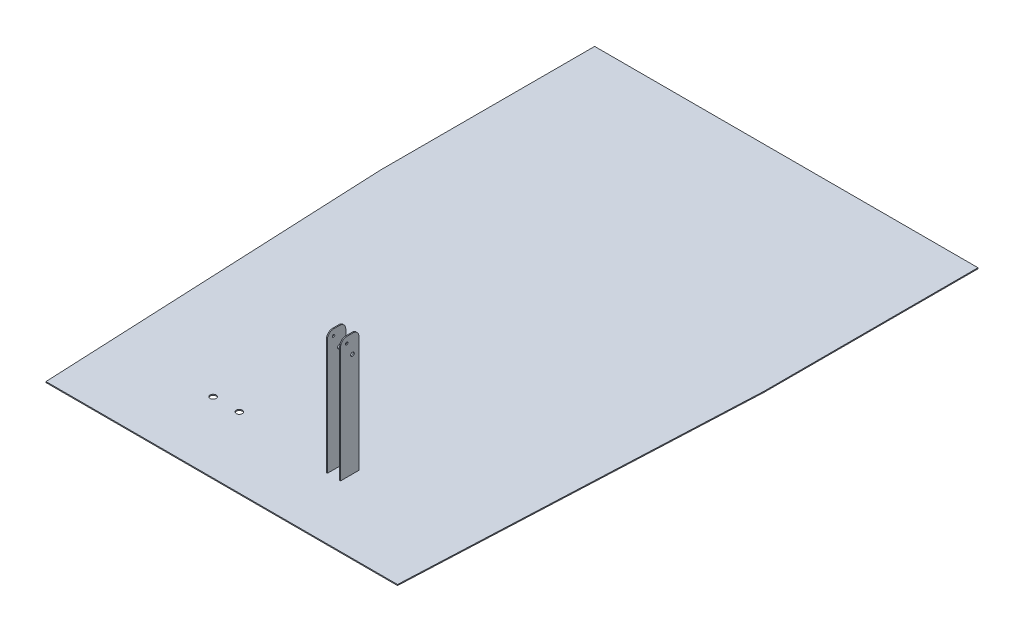
ISO-10303-21;
HEADER;
FILE_DESCRIPTION(('STEP AP214'),'2;1');
FILE_NAME('part.step','',(''),(''),'','','');
FILE_SCHEMA(('AUTOMOTIVE_DESIGN { 1 0 10303 214 1 1 1 1 }'));
ENDSEC;
DATA;
#1=APPLICATION_CONTEXT('core data for automotive mechanical design processes');
#2=APPLICATION_PROTOCOL_DEFINITION('international standard','automotive_design',2000,#1);
#3=PRODUCT_CONTEXT('',#1,'mechanical');
#4=PRODUCT('Part','Part','',(#3));
#5=PRODUCT_RELATED_PRODUCT_CATEGORY('part','',(#4));
#6=PRODUCT_DEFINITION_FORMATION('','',#4);
#7=PRODUCT_DEFINITION_CONTEXT('part definition',#1,'design');
#8=PRODUCT_DEFINITION('design','',#6,#7);
#9=PRODUCT_DEFINITION_SHAPE('','',#8);
#10=(LENGTH_UNIT() NAMED_UNIT(*) SI_UNIT(.MILLI.,.METRE.));
#11=(NAMED_UNIT(*) PLANE_ANGLE_UNIT() SI_UNIT($,.RADIAN.));
#12=(NAMED_UNIT(*) SI_UNIT($,.STERADIAN.) SOLID_ANGLE_UNIT());
#13=UNCERTAINTY_MEASURE_WITH_UNIT(LENGTH_MEASURE(1.E-05),#10,'distance_accuracy_value','');
#14=(GEOMETRIC_REPRESENTATION_CONTEXT(3) GLOBAL_UNCERTAINTY_ASSIGNED_CONTEXT((#13)) GLOBAL_UNIT_ASSIGNED_CONTEXT((#10,
#11,#12)) REPRESENTATION_CONTEXT('',''));
#15=CARTESIAN_POINT('',(0.,0.,0.));
#16=DIRECTION('',(0.,0.,1.));
#17=DIRECTION('',(1.,0.,0.));
#18=AXIS2_PLACEMENT_3D('',#15,#16,#17);
#19=CARTESIAN_POINT('',(0.,1.6,0.));
#20=DIRECTION('',(0.,1.,0.));
#21=DIRECTION('',(0.,0.,1.));
#22=AXIS2_PLACEMENT_3D('',#19,#20,#21);
#23=PLANE('',#22);
#24=CARTESIAN_POINT('',(201.5,1.6,-115.4));
#25=DIRECTION('',(0.,1.,0.));
#26=DIRECTION('',(0.,0.,1.));
#27=AXIS2_PLACEMENT_3D('',#24,#25,#26);
#28=CIRCLE('',#27,4.99999999999999);
#29=CARTESIAN_POINT('',(201.5,1.6,-110.4));
#30=VERTEX_POINT('',#29);
#31=EDGE_CURVE('E231',#30,#30,#28,.T.);
#32=ORIENTED_EDGE('',*,*,#31,.F.);
#33=EDGE_LOOP('',(#32));
#34=FACE_BOUND('',#33,.T.);
#35=CARTESIAN_POINT('',(158.5,1.6,-115.4));
#36=DIRECTION('',(0.,1.,0.));
#37=DIRECTION('',(0.,0.,1.));
#38=AXIS2_PLACEMENT_3D('',#35,#36,#37);
#39=CIRCLE('',#38,5.00000000000002);
#40=CARTESIAN_POINT('',(158.5,1.6,-110.4));
#41=VERTEX_POINT('',#40);
#42=EDGE_CURVE('E226',#41,#41,#39,.T.);
#43=ORIENTED_EDGE('',*,*,#42,.F.);
#44=EDGE_LOOP('',(#43));
#45=FACE_BOUND('',#44,.T.);
#46=DIRECTION('',(0.0453629881292508,0.,0.998970569790715));
#47=VECTOR('',#46,1.);
#48=CARTESIAN_POINT('',(-26.0788103978745,1.6,-574.3));
#49=LINE('',#48,#47);
#50=CARTESIAN_POINT('',(-26.0788103978745,1.6,-574.3));
#51=VERTEX_POINT('',#50);
#52=CARTESIAN_POINT('',(0.,1.6,0.));
#53=VERTEX_POINT('',#52);
#54=EDGE_CURVE('E239',#51,#53,#49,.T.);
#55=ORIENTED_EDGE('',*,*,#54,.T.);
#56=DIRECTION('',(1.,0.,0.));
#57=VECTOR('',#56,1.);
#58=CARTESIAN_POINT('',(0.,1.6,0.));
#59=LINE('',#58,#57);
#60=CARTESIAN_POINT('',(576.,1.6,0.));
#61=VERTEX_POINT('',#60);
#62=EDGE_CURVE('E242',#53,#61,#59,.T.);
#63=ORIENTED_EDGE('',*,*,#62,.T.);
#64=DIRECTION('',(0.0453629881292498,0.,-0.998970569790715));
#65=VECTOR('',#64,1.);
#66=CARTESIAN_POINT('',(576.,1.6,0.));
#67=LINE('',#66,#65);
#68=CARTESIAN_POINT('',(602.078810397874,1.6,-574.3));
#69=VERTEX_POINT('',#68);
#70=EDGE_CURVE('E245',#61,#69,#67,.T.);
#71=ORIENTED_EDGE('',*,*,#70,.T.);
#72=DIRECTION('',(0.,0.,-1.));
#73=VECTOR('',#72,1.);
#74=CARTESIAN_POINT('',(602.078810397874,1.6,-574.3));
#75=LINE('',#74,#73);
#76=CARTESIAN_POINT('',(602.078810397874,1.6,-925.100000000003));
#77=VERTEX_POINT('',#76);
#78=EDGE_CURVE('E247',#69,#77,#75,.T.);
#79=ORIENTED_EDGE('',*,*,#78,.T.);
#80=DIRECTION('',(-1.,0.,0.));
#81=VECTOR('',#80,1.);
#82=CARTESIAN_POINT('',(602.078810397874,1.6,-925.100000000003));
#83=LINE('',#82,#81);
#84=CARTESIAN_POINT('',(-26.0788103978746,1.6,-925.1));
#85=VERTEX_POINT('',#84);
#86=EDGE_CURVE('E249',#77,#85,#83,.T.);
#87=ORIENTED_EDGE('',*,*,#86,.T.);
#88=DIRECTION('',(0.,0.,1.));
#89=VECTOR('',#88,1.);
#90=CARTESIAN_POINT('',(-26.0788103978746,1.6,-925.1));
#91=LINE('',#90,#89);
#92=EDGE_CURVE('E251',#85,#51,#91,.T.);
#93=ORIENTED_EDGE('',*,*,#92,.T.);
#94=EDGE_LOOP('',(#55,#63,#71,#79,#87,#93));
#95=FACE_BOUND('',#94,.T.);
#96=DIRECTION('',(-1.,0.,0.));
#97=VECTOR('',#96,1.);
#98=CARTESIAN_POINT('',(359.2,1.6,-130.4));
#99=LINE('',#98,#97);
#100=CARTESIAN_POINT('',(360.8,1.6,-130.4));
#101=VERTEX_POINT('',#100);
#102=CARTESIAN_POINT('',(359.2,1.6,-130.4));
#103=VERTEX_POINT('',#102);
#104=EDGE_CURVE('E211',#101,#103,#99,.T.);
#105=ORIENTED_EDGE('',*,*,#104,.F.);
#106=DIRECTION('',(0.,0.,-1.));
#107=VECTOR('',#106,1.);
#108=CARTESIAN_POINT('',(360.8,1.6,-130.4));
#109=LINE('',#108,#107);
#110=CARTESIAN_POINT('',(360.8,1.6,-100.4));
#111=VERTEX_POINT('',#110);
#112=EDGE_CURVE('E173',#111,#101,#109,.T.);
#113=ORIENTED_EDGE('',*,*,#112,.F.);
#114=DIRECTION('',(1.,0.,0.));
#115=VECTOR('',#114,1.);
#116=CARTESIAN_POINT('',(359.2,1.6,-100.4));
#117=LINE('',#116,#115);
#118=CARTESIAN_POINT('',(359.2,1.6,-100.4));
#119=VERTEX_POINT('',#118);
#120=EDGE_CURVE('E205',#119,#111,#117,.T.);
#121=ORIENTED_EDGE('',*,*,#120,.F.);
#122=DIRECTION('',(0.,0.,1.));
#123=VECTOR('',#122,1.);
#124=CARTESIAN_POINT('',(359.2,1.6,-130.4));
#125=LINE('',#124,#123);
#126=EDGE_CURVE('E214',#103,#119,#125,.T.);
#127=ORIENTED_EDGE('',*,*,#126,.F.);
#128=EDGE_LOOP('',(#105,#113,#121,#127));
#129=FACE_BOUND('',#128,.T.);
#130=DIRECTION('',(-1.,0.,0.));
#131=VECTOR('',#130,1.);
#132=CARTESIAN_POINT('',(380.8,1.6,-130.4));
#133=LINE('',#132,#131);
#134=CARTESIAN_POINT('',(382.4,1.6,-130.4));
#135=VERTEX_POINT('',#134);
#136=CARTESIAN_POINT('',(380.8,1.6,-130.4));
#137=VERTEX_POINT('',#136);
#138=EDGE_CURVE('E168',#135,#137,#133,.T.);
#139=ORIENTED_EDGE('',*,*,#138,.F.);
#140=DIRECTION('',(0.,0.,-1.));
#141=VECTOR('',#140,1.);
#142=CARTESIAN_POINT('',(382.4,1.6,-130.4));
#143=LINE('',#142,#141);
#144=CARTESIAN_POINT('',(382.4,1.6,-100.4));
#145=VERTEX_POINT('',#144);
#146=EDGE_CURVE('E177',#145,#135,#143,.T.);
#147=ORIENTED_EDGE('',*,*,#146,.F.);
#148=DIRECTION('',(1.,0.,0.));
#149=VECTOR('',#148,1.);
#150=CARTESIAN_POINT('',(380.8,1.6,-100.4));
#151=LINE('',#150,#149);
#152=CARTESIAN_POINT('',(380.8,1.6,-100.4));
#153=VERTEX_POINT('',#152);
#154=EDGE_CURVE('E190',#153,#145,#151,.T.);
#155=ORIENTED_EDGE('',*,*,#154,.F.);
#156=DIRECTION('',(0.,0.,1.));
#157=VECTOR('',#156,1.);
#158=CARTESIAN_POINT('',(380.8,1.6,-130.4));
#159=LINE('',#158,#157);
#160=EDGE_CURVE('E188',#137,#153,#159,.T.);
#161=ORIENTED_EDGE('',*,*,#160,.F.);
#162=EDGE_LOOP('',(#139,#147,#155,#161));
#163=FACE_BOUND('',#162,.T.);
#164=ADVANCED_FACE('F38',(#34,#45,#95,#129,#163),#23,.T.);
#165=CARTESIAN_POINT('',(-26.0788103978745,1.6,-574.3));
#166=DIRECTION('',(0.998970569790715,0.,-0.0453629881292508));
#167=DIRECTION('',(-0.0453629881292508,0.,-0.998970569790715));
#168=AXIS2_PLACEMENT_3D('',#165,#166,#167);
#169=PLANE('',#168);
#170=DIRECTION('',(0.0453629881292508,0.,0.998970569790715));
#171=VECTOR('',#170,1.);
#172=CARTESIAN_POINT('',(-26.0788103978745,0.,-574.3));
#173=LINE('',#172,#171);
#174=CARTESIAN_POINT('',(-26.0788103978745,0.,-574.3));
#175=VERTEX_POINT('',#174);
#176=CARTESIAN_POINT('',(0.,0.,0.));
#177=VERTEX_POINT('',#176);
#178=EDGE_CURVE('E230',#175,#177,#173,.T.);
#179=ORIENTED_EDGE('',*,*,#178,.T.);
#180=DIRECTION('',(0.,-1.,0.));
#181=VECTOR('',#180,1.);
#182=CARTESIAN_POINT('',(0.,1.6,0.));
#183=LINE('',#182,#181);
#184=EDGE_CURVE('E279',#53,#177,#183,.T.);
#185=ORIENTED_EDGE('',*,*,#184,.F.);
#186=ORIENTED_EDGE('',*,*,#54,.F.);
#187=DIRECTION('',(0.,-1.,0.));
#188=VECTOR('',#187,1.);
#189=CARTESIAN_POINT('',(-26.0788103978745,1.6,-574.3));
#190=LINE('',#189,#188);
#191=EDGE_CURVE('E253',#51,#175,#190,.T.);
#192=ORIENTED_EDGE('',*,*,#191,.T.);
#193=EDGE_LOOP('',(#179,#185,#186,#192));
#194=FACE_BOUND('',#193,.T.);
#195=ADVANCED_FACE('F346',(#194),#169,.F.);
#196=CARTESIAN_POINT('',(0.,1.6,0.));
#197=DIRECTION('',(0.,0.,-1.));
#198=DIRECTION('',(-1.,0.,0.));
#199=AXIS2_PLACEMENT_3D('',#196,#197,#198);
#200=PLANE('',#199);
#201=DIRECTION('',(1.,0.,0.));
#202=VECTOR('',#201,1.);
#203=CARTESIAN_POINT('',(0.,0.,0.));
#204=LINE('',#203,#202);
#205=CARTESIAN_POINT('',(576.,0.,0.));
#206=VERTEX_POINT('',#205);
#207=EDGE_CURVE('E256',#177,#206,#204,.T.);
#208=ORIENTED_EDGE('',*,*,#207,.T.);
#209=DIRECTION('',(0.,-1.,0.));
#210=VECTOR('',#209,1.);
#211=CARTESIAN_POINT('',(576.,1.6,0.));
#212=LINE('',#211,#210);
#213=EDGE_CURVE('E276',#61,#206,#212,.T.);
#214=ORIENTED_EDGE('',*,*,#213,.F.);
#215=ORIENTED_EDGE('',*,*,#62,.F.);
#216=ORIENTED_EDGE('',*,*,#184,.T.);
#217=EDGE_LOOP('',(#208,#214,#215,#216));
#218=FACE_BOUND('',#217,.T.);
#219=ADVANCED_FACE('F352',(#218),#200,.F.);
#220=CARTESIAN_POINT('',(576.,1.6,0.));
#221=DIRECTION('',(-0.998970569790715,0.,-0.0453629881292498));
#222=DIRECTION('',(-0.0453629881292498,0.,0.998970569790715));
#223=AXIS2_PLACEMENT_3D('',#220,#221,#222);
#224=PLANE('',#223);
#225=DIRECTION('',(0.0453629881292498,0.,-0.998970569790715));
#226=VECTOR('',#225,1.);
#227=CARTESIAN_POINT('',(576.,0.,0.));
#228=LINE('',#227,#226);
#229=CARTESIAN_POINT('',(602.078810397874,0.,-574.3));
#230=VERTEX_POINT('',#229);
#231=EDGE_CURVE('E258',#206,#230,#228,.T.);
#232=ORIENTED_EDGE('',*,*,#231,.T.);
#233=DIRECTION('',(0.,-1.,0.));
#234=VECTOR('',#233,1.);
#235=CARTESIAN_POINT('',(602.078810397874,1.6,-574.3));
#236=LINE('',#235,#234);
#237=EDGE_CURVE('E273',#69,#230,#236,.T.);
#238=ORIENTED_EDGE('',*,*,#237,.F.);
#239=ORIENTED_EDGE('',*,*,#70,.F.);
#240=ORIENTED_EDGE('',*,*,#213,.T.);
#241=EDGE_LOOP('',(#232,#238,#239,#240));
#242=FACE_BOUND('',#241,.T.);
#243=ADVANCED_FACE('F376',(#242),#224,.F.);
#244=CARTESIAN_POINT('',(602.078810397874,1.6,-574.3));
#245=DIRECTION('',(-1.,0.,0.));
#246=DIRECTION('',(0.,0.,1.));
#247=AXIS2_PLACEMENT_3D('',#244,#245,#246);
#248=PLANE('',#247);
#249=DIRECTION('',(0.,0.,-1.));
#250=VECTOR('',#249,1.);
#251=CARTESIAN_POINT('',(602.078810397874,0.,-574.3));
#252=LINE('',#251,#250);
#253=CARTESIAN_POINT('',(602.078810397874,0.,-925.100000000003));
#254=VERTEX_POINT('',#253);
#255=EDGE_CURVE('E260',#230,#254,#252,.T.);
#256=ORIENTED_EDGE('',*,*,#255,.T.);
#257=DIRECTION('',(0.,-1.,0.));
#258=VECTOR('',#257,1.);
#259=CARTESIAN_POINT('',(602.078810397874,1.6,-925.100000000003));
#260=LINE('',#259,#258);
#261=EDGE_CURVE('E270',#77,#254,#260,.T.);
#262=ORIENTED_EDGE('',*,*,#261,.F.);
#263=ORIENTED_EDGE('',*,*,#78,.F.);
#264=ORIENTED_EDGE('',*,*,#237,.T.);
#265=EDGE_LOOP('',(#256,#262,#263,#264));
#266=FACE_BOUND('',#265,.T.);
#267=ADVANCED_FACE('F372',(#266),#248,.F.);
#268=CARTESIAN_POINT('',(602.078810397874,1.6,-925.100000000003));
#269=DIRECTION('',(0.,0.,1.));
#270=DIRECTION('',(1.,0.,0.));
#271=AXIS2_PLACEMENT_3D('',#268,#269,#270);
#272=PLANE('',#271);
#273=DIRECTION('',(-1.,0.,0.));
#274=VECTOR('',#273,1.);
#275=CARTESIAN_POINT('',(602.078810397874,0.,-925.100000000003));
#276=LINE('',#275,#274);
#277=CARTESIAN_POINT('',(-26.0788103978746,0.,-925.1));
#278=VERTEX_POINT('',#277);
#279=EDGE_CURVE('E262',#254,#278,#276,.T.);
#280=ORIENTED_EDGE('',*,*,#279,.T.);
#281=DIRECTION('',(0.,-1.,0.));
#282=VECTOR('',#281,1.);
#283=CARTESIAN_POINT('',(-26.0788103978746,1.6,-925.1));
#284=LINE('',#283,#282);
#285=EDGE_CURVE('E267',#85,#278,#284,.T.);
#286=ORIENTED_EDGE('',*,*,#285,.F.);
#287=ORIENTED_EDGE('',*,*,#86,.F.);
#288=ORIENTED_EDGE('',*,*,#261,.T.);
#289=EDGE_LOOP('',(#280,#286,#287,#288));
#290=FACE_BOUND('',#289,.T.);
#291=ADVANCED_FACE('F368',(#290),#272,.F.);
#292=CARTESIAN_POINT('',(-26.0788103978746,1.6,-925.1));
#293=DIRECTION('',(1.,0.,0.));
#294=DIRECTION('',(0.,0.,-1.));
#295=AXIS2_PLACEMENT_3D('',#292,#293,#294);
#296=PLANE('',#295);
#297=DIRECTION('',(0.,0.,1.));
#298=VECTOR('',#297,1.);
#299=CARTESIAN_POINT('',(-26.0788103978746,0.,-925.1));
#300=LINE('',#299,#298);
#301=EDGE_CURVE('E243',#278,#175,#300,.T.);
#302=ORIENTED_EDGE('',*,*,#301,.T.);
#303=ORIENTED_EDGE('',*,*,#191,.F.);
#304=ORIENTED_EDGE('',*,*,#92,.F.);
#305=ORIENTED_EDGE('',*,*,#285,.T.);
#306=EDGE_LOOP('',(#302,#303,#304,#305));
#307=FACE_BOUND('',#306,.T.);
#308=ADVANCED_FACE('F364',(#307),#296,.F.);
#309=CARTESIAN_POINT('',(0.,0.,0.));
#310=DIRECTION('',(0.,1.,0.));
#311=DIRECTION('',(0.,0.,1.));
#312=AXIS2_PLACEMENT_3D('',#309,#310,#311);
#313=PLANE('',#312);
#314=CARTESIAN_POINT('',(201.5,0.,-115.4));
#315=DIRECTION('',(0.,1.,0.));
#316=DIRECTION('',(0.,0.,1.));
#317=AXIS2_PLACEMENT_3D('',#314,#315,#316);
#318=CIRCLE('',#317,4.99999999999999);
#319=CARTESIAN_POINT('',(201.5,0.,-110.4));
#320=VERTEX_POINT('',#319);
#321=EDGE_CURVE('E227',#320,#320,#318,.T.);
#322=ORIENTED_EDGE('',*,*,#321,.T.);
#323=EDGE_LOOP('',(#322));
#324=FACE_BOUND('',#323,.T.);
#325=CARTESIAN_POINT('',(158.5,0.,-115.4));
#326=DIRECTION('',(0.,1.,0.));
#327=DIRECTION('',(0.,0.,1.));
#328=AXIS2_PLACEMENT_3D('',#325,#326,#327);
#329=CIRCLE('',#328,5.00000000000002);
#330=CARTESIAN_POINT('',(158.5,0.,-110.4));
#331=VERTEX_POINT('',#330);
#332=EDGE_CURVE('E234',#331,#331,#329,.T.);
#333=ORIENTED_EDGE('',*,*,#332,.T.);
#334=EDGE_LOOP('',(#333));
#335=FACE_BOUND('',#334,.T.);
#336=ORIENTED_EDGE('',*,*,#178,.F.);
#337=ORIENTED_EDGE('',*,*,#301,.F.);
#338=ORIENTED_EDGE('',*,*,#279,.F.);
#339=ORIENTED_EDGE('',*,*,#255,.F.);
#340=ORIENTED_EDGE('',*,*,#231,.F.);
#341=ORIENTED_EDGE('',*,*,#207,.F.);
#342=EDGE_LOOP('',(#336,#337,#338,#339,#340,#341));
#343=FACE_BOUND('',#342,.T.);
#344=ADVANCED_FACE('F361',(#324,#335,#343),#313,.F.);
#345=CARTESIAN_POINT('',(158.5,0.,-115.4));
#346=DIRECTION('',(0.,1.,0.));
#347=DIRECTION('',(0.,0.,1.));
#348=AXIS2_PLACEMENT_3D('',#345,#346,#347);
#349=CYLINDRICAL_SURFACE('',#348,5.00000000000002);
#350=ORIENTED_EDGE('',*,*,#332,.F.);
#351=EDGE_LOOP('',(#350));
#352=FACE_BOUND('',#351,.T.);
#353=ORIENTED_EDGE('',*,*,#42,.T.);
#354=EDGE_LOOP('',(#353));
#355=FACE_BOUND('',#354,.T.);
#356=ADVANCED_FACE('F359',(#352,#355),#349,.F.);
#357=CARTESIAN_POINT('',(201.5,0.,-115.4));
#358=DIRECTION('',(0.,1.,0.));
#359=DIRECTION('',(0.,0.,1.));
#360=AXIS2_PLACEMENT_3D('',#357,#358,#359);
#361=CYLINDRICAL_SURFACE('',#360,4.99999999999999);
#362=ORIENTED_EDGE('',*,*,#321,.F.);
#363=EDGE_LOOP('',(#362));
#364=FACE_BOUND('',#363,.T.);
#365=ORIENTED_EDGE('',*,*,#31,.T.);
#366=EDGE_LOOP('',(#365));
#367=FACE_BOUND('',#366,.T.);
#368=ADVANCED_FACE('F464',(#364,#367),#361,.F.);
#369=CARTESIAN_POINT('',(360.8,201.6,-130.4));
#370=DIRECTION('',(-1.,0.,0.));
#371=DIRECTION('',(0.,0.,1.));
#372=AXIS2_PLACEMENT_3D('',#369,#370,#371);
#373=PLANE('',#372);
#374=CARTESIAN_POINT('',(360.8,191.6,-110.4));
#375=DIRECTION('',(-1.,0.,0.));
#376=DIRECTION('',(0.,0.,1.));
#377=AXIS2_PLACEMENT_3D('',#374,#375,#376);
#378=CIRCLE('',#377,2.);
#379=CARTESIAN_POINT('',(360.8,191.6,-108.4));
#380=VERTEX_POINT('',#379);
#381=EDGE_CURVE('E185',#380,#380,#378,.T.);
#382=ORIENTED_EDGE('',*,*,#381,.T.);
#383=EDGE_LOOP('',(#382));
#384=FACE_BOUND('',#383,.T.);
#385=CARTESIAN_POINT('',(360.8,171.6,-119.7261531631));
#386=DIRECTION('',(-1.,0.,0.));
#387=DIRECTION('',(0.,0.,1.));
#388=AXIS2_PLACEMENT_3D('',#385,#386,#387);
#389=CIRCLE('',#388,2.99999999999999);
#390=CARTESIAN_POINT('',(360.8,171.6,-116.7261531631));
#391=VERTEX_POINT('',#390);
#392=EDGE_CURVE('E292',#391,#391,#389,.T.);
#393=ORIENTED_EDGE('',*,*,#392,.T.);
#394=EDGE_LOOP('',(#393));
#395=FACE_BOUND('',#394,.T.);
#396=DIRECTION('',(0.,0.,-1.));
#397=VECTOR('',#396,1.);
#398=CARTESIAN_POINT('',(360.8,201.6,-130.4));
#399=LINE('',#398,#397);
#400=CARTESIAN_POINT('',(360.8,201.6,-110.4));
#401=VERTEX_POINT('',#400);
#402=CARTESIAN_POINT('',(360.8,201.6,-120.4));
#403=VERTEX_POINT('',#402);
#404=EDGE_CURVE('E201',#401,#403,#399,.T.);
#405=ORIENTED_EDGE('',*,*,#404,.F.);
#406=CARTESIAN_POINT('',(360.8,191.6,-110.4));
#407=DIRECTION('',(-1.,0.,0.));
#408=DIRECTION('',(0.,0.,1.));
#409=AXIS2_PLACEMENT_3D('',#406,#407,#408);
#410=CIRCLE('',#409,10.);
#411=CARTESIAN_POINT('',(360.8,191.6,-100.4));
#412=VERTEX_POINT('',#411);
#413=EDGE_CURVE('E316',#401,#412,#410,.F.);
#414=ORIENTED_EDGE('',*,*,#413,.T.);
#415=DIRECTION('',(0.,-1.,0.));
#416=VECTOR('',#415,1.);
#417=CARTESIAN_POINT('',(360.8,201.6,-100.4));
#418=LINE('',#417,#416);
#419=EDGE_CURVE('E208',#412,#111,#418,.T.);
#420=ORIENTED_EDGE('',*,*,#419,.T.);
#421=ORIENTED_EDGE('',*,*,#112,.T.);
#422=DIRECTION('',(0.,-1.,0.));
#423=VECTOR('',#422,1.);
#424=CARTESIAN_POINT('',(360.8,201.6,-130.4));
#425=LINE('',#424,#423);
#426=CARTESIAN_POINT('',(360.8,191.6,-130.4));
#427=VERTEX_POINT('',#426);
#428=EDGE_CURVE('E224',#427,#101,#425,.T.);
#429=ORIENTED_EDGE('',*,*,#428,.F.);
#430=CARTESIAN_POINT('',(360.8,191.6,-120.4));
#431=DIRECTION('',(-1.,0.,0.));
#432=DIRECTION('',(0.,0.,1.));
#433=AXIS2_PLACEMENT_3D('',#430,#431,#432);
#434=CIRCLE('',#433,10.);
#435=EDGE_CURVE('E314',#427,#403,#434,.F.);
#436=ORIENTED_EDGE('',*,*,#435,.T.);
#437=EDGE_LOOP('',(#405,#414,#420,#421,#429,#436));
#438=FACE_BOUND('',#437,.T.);
#439=ADVANCED_FACE('F329',(#384,#395,#438),#373,.F.);
#440=CARTESIAN_POINT('',(359.2,201.6,-130.4));
#441=DIRECTION('',(0.,0.,1.));
#442=DIRECTION('',(1.,0.,0.));
#443=AXIS2_PLACEMENT_3D('',#440,#441,#442);
#444=PLANE('',#443);
#445=DIRECTION('',(0.,-1.,0.));
#446=VECTOR('',#445,1.);
#447=CARTESIAN_POINT('',(359.2,201.6,-130.4));
#448=LINE('',#447,#446);
#449=CARTESIAN_POINT('',(359.2,191.6,-130.4));
#450=VERTEX_POINT('',#449);
#451=EDGE_CURVE('E222',#450,#103,#448,.T.);
#452=ORIENTED_EDGE('',*,*,#451,.F.);
#453=DIRECTION('',(-1.,0.,0.));
#454=VECTOR('',#453,1.);
#455=CARTESIAN_POINT('',(360.8,191.6,-130.4));
#456=LINE('',#455,#454);
#457=EDGE_CURVE('E46',#450,#427,#456,.F.);
#458=ORIENTED_EDGE('',*,*,#457,.T.);
#459=ORIENTED_EDGE('',*,*,#428,.T.);
#460=ORIENTED_EDGE('',*,*,#104,.T.);
#461=EDGE_LOOP('',(#452,#458,#459,#460));
#462=FACE_BOUND('',#461,.T.);
#463=ADVANCED_FACE('F324',(#462),#444,.F.);
#464=CARTESIAN_POINT('',(359.2,201.6,-130.4));
#465=DIRECTION('',(1.,0.,0.));
#466=DIRECTION('',(0.,0.,-1.));
#467=AXIS2_PLACEMENT_3D('',#464,#465,#466);
#468=PLANE('',#467);
#469=CARTESIAN_POINT('',(359.2,191.6,-110.4));
#470=DIRECTION('',(1.,0.,0.));
#471=DIRECTION('',(0.,0.,-1.));
#472=AXIS2_PLACEMENT_3D('',#469,#470,#471);
#473=CIRCLE('',#472,2.);
#474=CARTESIAN_POINT('',(359.2,191.6,-112.4));
#475=VERTEX_POINT('',#474);
#476=EDGE_CURVE('E291',#475,#475,#473,.T.);
#477=ORIENTED_EDGE('',*,*,#476,.T.);
#478=EDGE_LOOP('',(#477));
#479=FACE_BOUND('',#478,.T.);
#480=CARTESIAN_POINT('',(359.2,171.6,-119.7261531631));
#481=DIRECTION('',(1.,0.,0.));
#482=DIRECTION('',(0.,0.,-1.));
#483=AXIS2_PLACEMENT_3D('',#480,#481,#482);
#484=CIRCLE('',#483,2.99999999999999);
#485=CARTESIAN_POINT('',(359.2,171.6,-122.7261531631));
#486=VERTEX_POINT('',#485);
#487=EDGE_CURVE('E286',#486,#486,#484,.T.);
#488=ORIENTED_EDGE('',*,*,#487,.T.);
#489=EDGE_LOOP('',(#488));
#490=FACE_BOUND('',#489,.T.);
#491=DIRECTION('',(0.,-1.,0.));
#492=VECTOR('',#491,1.);
#493=CARTESIAN_POINT('',(359.2,201.6,-100.4));
#494=LINE('',#493,#492);
#495=CARTESIAN_POINT('',(359.2,191.6,-100.4));
#496=VERTEX_POINT('',#495);
#497=EDGE_CURVE('E220',#496,#119,#494,.T.);
#498=ORIENTED_EDGE('',*,*,#497,.F.);
#499=CARTESIAN_POINT('',(359.2,191.6,-110.4));
#500=DIRECTION('',(1.,0.,0.));
#501=DIRECTION('',(0.,0.,-1.));
#502=AXIS2_PLACEMENT_3D('',#499,#500,#501);
#503=CIRCLE('',#502,10.);
#504=CARTESIAN_POINT('',(359.2,201.6,-110.4));
#505=VERTEX_POINT('',#504);
#506=EDGE_CURVE('E320',#496,#505,#503,.F.);
#507=ORIENTED_EDGE('',*,*,#506,.T.);
#508=DIRECTION('',(0.,0.,1.));
#509=VECTOR('',#508,1.);
#510=CARTESIAN_POINT('',(359.2,201.6,-130.4));
#511=LINE('',#510,#509);
#512=CARTESIAN_POINT('',(359.2,201.6,-120.4));
#513=VERTEX_POINT('',#512);
#514=EDGE_CURVE('E204',#513,#505,#511,.T.);
#515=ORIENTED_EDGE('',*,*,#514,.F.);
#516=CARTESIAN_POINT('',(359.2,191.6,-120.4));
#517=DIRECTION('',(1.,0.,0.));
#518=DIRECTION('',(0.,0.,-1.));
#519=AXIS2_PLACEMENT_3D('',#516,#517,#518);
#520=CIRCLE('',#519,10.);
#521=EDGE_CURVE('E53',#513,#450,#520,.F.);
#522=ORIENTED_EDGE('',*,*,#521,.T.);
#523=ORIENTED_EDGE('',*,*,#451,.T.);
#524=ORIENTED_EDGE('',*,*,#126,.T.);
#525=EDGE_LOOP('',(#498,#507,#515,#522,#523,#524));
#526=FACE_BOUND('',#525,.T.);
#527=ADVANCED_FACE('F337',(#479,#490,#526),#468,.F.);
#528=CARTESIAN_POINT('',(359.2,201.6,-100.4));
#529=DIRECTION('',(0.,0.,-1.));
#530=DIRECTION('',(-1.,0.,0.));
#531=AXIS2_PLACEMENT_3D('',#528,#529,#530);
#532=PLANE('',#531);
#533=ORIENTED_EDGE('',*,*,#419,.F.);
#534=DIRECTION('',(1.,0.,0.));
#535=VECTOR('',#534,1.);
#536=CARTESIAN_POINT('',(359.2,191.6,-100.4));
#537=LINE('',#536,#535);
#538=EDGE_CURVE('E61',#412,#496,#537,.F.);
#539=ORIENTED_EDGE('',*,*,#538,.T.);
#540=ORIENTED_EDGE('',*,*,#497,.T.);
#541=ORIENTED_EDGE('',*,*,#120,.T.);
#542=EDGE_LOOP('',(#533,#539,#540,#541));
#543=FACE_BOUND('',#542,.T.);
#544=ADVANCED_FACE('F341',(#543),#532,.F.);
#545=CARTESIAN_POINT('',(0.,201.6,0.));
#546=DIRECTION('',(0.,1.,0.));
#547=DIRECTION('',(0.,0.,1.));
#548=AXIS2_PLACEMENT_3D('',#545,#546,#547);
#549=PLANE('',#548);
#550=ORIENTED_EDGE('',*,*,#514,.T.);
#551=DIRECTION('',(1.,0.,0.));
#552=VECTOR('',#551,1.);
#553=CARTESIAN_POINT('',(360.8,201.6,-110.4));
#554=LINE('',#553,#552);
#555=EDGE_CURVE('E311',#505,#401,#554,.T.);
#556=ORIENTED_EDGE('',*,*,#555,.T.);
#557=ORIENTED_EDGE('',*,*,#404,.T.);
#558=DIRECTION('',(-1.,0.,0.));
#559=VECTOR('',#558,1.);
#560=CARTESIAN_POINT('',(359.2,201.6,-120.4));
#561=LINE('',#560,#559);
#562=EDGE_CURVE('E308',#403,#513,#561,.T.);
#563=ORIENTED_EDGE('',*,*,#562,.T.);
#564=EDGE_LOOP('',(#550,#556,#557,#563));
#565=FACE_BOUND('',#564,.T.);
#566=ADVANCED_FACE('F335',(#565),#549,.T.);
#567=CARTESIAN_POINT('',(382.4,201.6,-130.4));
#568=DIRECTION('',(-1.,0.,0.));
#569=DIRECTION('',(0.,0.,1.));
#570=AXIS2_PLACEMENT_3D('',#567,#568,#569);
#571=PLANE('',#570);
#572=CARTESIAN_POINT('',(382.4,191.6,-110.4));
#573=DIRECTION('',(1.,0.,0.));
#574=DIRECTION('',(0.,0.,-1.));
#575=AXIS2_PLACEMENT_3D('',#572,#573,#574);
#576=CIRCLE('',#575,2.);
#577=CARTESIAN_POINT('',(382.4,191.6,-112.4));
#578=VERTEX_POINT('',#577);
#579=EDGE_CURVE('E287',#578,#578,#576,.T.);
#580=ORIENTED_EDGE('',*,*,#579,.F.);
#581=EDGE_LOOP('',(#580));
#582=FACE_BOUND('',#581,.T.);
#583=CARTESIAN_POINT('',(382.4,171.6,-119.7261531631));
#584=DIRECTION('',(1.,0.,0.));
#585=DIRECTION('',(0.,0.,-1.));
#586=AXIS2_PLACEMENT_3D('',#583,#584,#585);
#587=CIRCLE('',#586,2.99999999999999);
#588=CARTESIAN_POINT('',(382.4,171.6,-122.7261531631));
#589=VERTEX_POINT('',#588);
#590=EDGE_CURVE('E414',#589,#589,#587,.T.);
#591=ORIENTED_EDGE('',*,*,#590,.F.);
#592=EDGE_LOOP('',(#591));
#593=FACE_BOUND('',#592,.T.);
#594=DIRECTION('',(0.,0.,-1.));
#595=VECTOR('',#594,1.);
#596=CARTESIAN_POINT('',(382.4,201.6,-130.4));
#597=LINE('',#596,#595);
#598=CARTESIAN_POINT('',(382.4,201.6,-110.4));
#599=VERTEX_POINT('',#598);
#600=CARTESIAN_POINT('',(382.4,201.6,-120.4));
#601=VERTEX_POINT('',#600);
#602=EDGE_CURVE('E195',#599,#601,#597,.T.);
#603=ORIENTED_EDGE('',*,*,#602,.F.);
#604=CARTESIAN_POINT('',(382.4,191.6,-110.4));
#605=DIRECTION('',(-1.,0.,0.));
#606=DIRECTION('',(0.,0.,1.));
#607=AXIS2_PLACEMENT_3D('',#604,#605,#606);
#608=CIRCLE('',#607,10.);
#609=CARTESIAN_POINT('',(382.4,191.6,-100.4));
#610=VERTEX_POINT('',#609);
#611=EDGE_CURVE('E300',#599,#610,#608,.F.);
#612=ORIENTED_EDGE('',*,*,#611,.T.);
#613=DIRECTION('',(0.,-1.,0.));
#614=VECTOR('',#613,1.);
#615=CARTESIAN_POINT('',(382.4,201.6,-100.4));
#616=LINE('',#615,#614);
#617=EDGE_CURVE('E181',#610,#145,#616,.T.);
#618=ORIENTED_EDGE('',*,*,#617,.T.);
#619=ORIENTED_EDGE('',*,*,#146,.T.);
#620=DIRECTION('',(0.,-1.,0.));
#621=VECTOR('',#620,1.);
#622=CARTESIAN_POINT('',(382.4,201.6,-130.4));
#623=LINE('',#622,#621);
#624=CARTESIAN_POINT('',(382.4,191.6,-130.4));
#625=VERTEX_POINT('',#624);
#626=EDGE_CURVE('E163',#625,#135,#623,.T.);
#627=ORIENTED_EDGE('',*,*,#626,.F.);
#628=CARTESIAN_POINT('',(382.4,191.6,-120.4));
#629=DIRECTION('',(-1.,0.,0.));
#630=DIRECTION('',(0.,0.,1.));
#631=AXIS2_PLACEMENT_3D('',#628,#629,#630);
#632=CIRCLE('',#631,10.);
#633=EDGE_CURVE('E298',#625,#601,#632,.F.);
#634=ORIENTED_EDGE('',*,*,#633,.T.);
#635=EDGE_LOOP('',(#603,#612,#618,#619,#627,#634));
#636=FACE_BOUND('',#635,.T.);
#637=ADVANCED_FACE('F179',(#582,#593,#636),#571,.F.);
#638=CARTESIAN_POINT('',(380.8,201.6,-130.4));
#639=DIRECTION('',(0.,0.,1.));
#640=DIRECTION('',(1.,0.,0.));
#641=AXIS2_PLACEMENT_3D('',#638,#639,#640);
#642=PLANE('',#641);
#643=DIRECTION('',(0.,-1.,0.));
#644=VECTOR('',#643,1.);
#645=CARTESIAN_POINT('',(380.8,201.6,-130.4));
#646=LINE('',#645,#644);
#647=CARTESIAN_POINT('',(380.8,191.6,-130.4));
#648=VERTEX_POINT('',#647);
#649=EDGE_CURVE('E174',#648,#137,#646,.T.);
#650=ORIENTED_EDGE('',*,*,#649,.F.);
#651=DIRECTION('',(-1.,0.,0.));
#652=VECTOR('',#651,1.);
#653=CARTESIAN_POINT('',(382.4,191.6,-130.4));
#654=LINE('',#653,#652);
#655=EDGE_CURVE('E11',#648,#625,#654,.F.);
#656=ORIENTED_EDGE('',*,*,#655,.T.);
#657=ORIENTED_EDGE('',*,*,#626,.T.);
#658=ORIENTED_EDGE('',*,*,#138,.T.);
#659=EDGE_LOOP('',(#650,#656,#657,#658));
#660=FACE_BOUND('',#659,.T.);
#661=ADVANCED_FACE('F166',(#660),#642,.F.);
#662=CARTESIAN_POINT('',(380.8,201.6,-130.4));
#663=DIRECTION('',(1.,0.,0.));
#664=DIRECTION('',(0.,0.,-1.));
#665=AXIS2_PLACEMENT_3D('',#662,#663,#664);
#666=PLANE('',#665);
#667=CARTESIAN_POINT('',(380.8,191.6,-110.4));
#668=DIRECTION('',(1.,0.,0.));
#669=DIRECTION('',(0.,0.,-1.));
#670=AXIS2_PLACEMENT_3D('',#667,#668,#669);
#671=CIRCLE('',#670,2.);
#672=CARTESIAN_POINT('',(380.8,191.6,-112.4));
#673=VERTEX_POINT('',#672);
#674=EDGE_CURVE('E288',#673,#673,#671,.T.);
#675=ORIENTED_EDGE('',*,*,#674,.T.);
#676=EDGE_LOOP('',(#675));
#677=FACE_BOUND('',#676,.T.);
#678=CARTESIAN_POINT('',(380.8,171.6,-119.7261531631));
#679=DIRECTION('',(1.,0.,0.));
#680=DIRECTION('',(0.,0.,-1.));
#681=AXIS2_PLACEMENT_3D('',#678,#679,#680);
#682=CIRCLE('',#681,2.99999999999999);
#683=CARTESIAN_POINT('',(380.8,171.6,-122.7261531631));
#684=VERTEX_POINT('',#683);
#685=EDGE_CURVE('E283',#684,#684,#682,.T.);
#686=ORIENTED_EDGE('',*,*,#685,.T.);
#687=EDGE_LOOP('',(#686));
#688=FACE_BOUND('',#687,.T.);
#689=DIRECTION('',(0.,-1.,0.));
#690=VECTOR('',#689,1.);
#691=CARTESIAN_POINT('',(380.8,201.6,-100.4));
#692=LINE('',#691,#690);
#693=CARTESIAN_POINT('',(380.8,191.6,-100.4));
#694=VERTEX_POINT('',#693);
#695=EDGE_CURVE('E197',#694,#153,#692,.T.);
#696=ORIENTED_EDGE('',*,*,#695,.F.);
#697=CARTESIAN_POINT('',(380.8,191.6,-110.4));
#698=DIRECTION('',(1.,0.,0.));
#699=DIRECTION('',(0.,0.,-1.));
#700=AXIS2_PLACEMENT_3D('',#697,#698,#699);
#701=CIRCLE('',#700,10.);
#702=CARTESIAN_POINT('',(380.8,201.6,-110.4));
#703=VERTEX_POINT('',#702);
#704=EDGE_CURVE('E306',#694,#703,#701,.F.);
#705=ORIENTED_EDGE('',*,*,#704,.T.);
#706=DIRECTION('',(0.,0.,1.));
#707=VECTOR('',#706,1.);
#708=CARTESIAN_POINT('',(380.8,201.6,-130.4));
#709=LINE('',#708,#707);
#710=CARTESIAN_POINT('',(380.8,201.6,-120.4));
#711=VERTEX_POINT('',#710);
#712=EDGE_CURVE('E198',#711,#703,#709,.T.);
#713=ORIENTED_EDGE('',*,*,#712,.F.);
#714=CARTESIAN_POINT('',(380.8,191.6,-120.4));
#715=DIRECTION('',(1.,0.,0.));
#716=DIRECTION('',(0.,0.,-1.));
#717=AXIS2_PLACEMENT_3D('',#714,#715,#716);
#718=CIRCLE('',#717,10.);
#719=EDGE_CURVE('E304',#711,#648,#718,.F.);
#720=ORIENTED_EDGE('',*,*,#719,.T.);
#721=ORIENTED_EDGE('',*,*,#649,.T.);
#722=ORIENTED_EDGE('',*,*,#160,.T.);
#723=EDGE_LOOP('',(#696,#705,#713,#720,#721,#722));
#724=FACE_BOUND('',#723,.T.);
#725=ADVANCED_FACE('F435',(#677,#688,#724),#666,.F.);
#726=CARTESIAN_POINT('',(380.8,201.6,-100.4));
#727=DIRECTION('',(0.,0.,-1.));
#728=DIRECTION('',(-1.,0.,0.));
#729=AXIS2_PLACEMENT_3D('',#726,#727,#728);
#730=PLANE('',#729);
#731=ORIENTED_EDGE('',*,*,#617,.F.);
#732=DIRECTION('',(1.,0.,0.));
#733=VECTOR('',#732,1.);
#734=CARTESIAN_POINT('',(380.8,191.6,-100.4));
#735=LINE('',#734,#733);
#736=EDGE_CURVE('E302',#610,#694,#735,.F.);
#737=ORIENTED_EDGE('',*,*,#736,.T.);
#738=ORIENTED_EDGE('',*,*,#695,.T.);
#739=ORIENTED_EDGE('',*,*,#154,.T.);
#740=EDGE_LOOP('',(#731,#737,#738,#739));
#741=FACE_BOUND('',#740,.T.);
#742=ADVANCED_FACE('F438',(#741),#730,.F.);
#743=CARTESIAN_POINT('',(0.,201.6,0.));
#744=DIRECTION('',(0.,1.,0.));
#745=DIRECTION('',(0.,0.,1.));
#746=AXIS2_PLACEMENT_3D('',#743,#744,#745);
#747=PLANE('',#746);
#748=ORIENTED_EDGE('',*,*,#712,.T.);
#749=DIRECTION('',(1.,0.,0.));
#750=VECTOR('',#749,1.);
#751=CARTESIAN_POINT('',(382.4,201.6,-110.4));
#752=LINE('',#751,#750);
#753=EDGE_CURVE('E295',#703,#599,#752,.T.);
#754=ORIENTED_EDGE('',*,*,#753,.T.);
#755=ORIENTED_EDGE('',*,*,#602,.T.);
#756=DIRECTION('',(-1.,0.,0.));
#757=VECTOR('',#756,1.);
#758=CARTESIAN_POINT('',(380.8,201.6,-120.4));
#759=LINE('',#758,#757);
#760=EDGE_CURVE('E282',#601,#711,#759,.T.);
#761=ORIENTED_EDGE('',*,*,#760,.T.);
#762=EDGE_LOOP('',(#748,#754,#755,#761));
#763=FACE_BOUND('',#762,.T.);
#764=ADVANCED_FACE('F401',(#763),#747,.T.);
#765=CARTESIAN_POINT('',(-26.0788103978746,171.6,-119.7261531631));
#766=DIRECTION('',(1.,0.,0.));
#767=DIRECTION('',(0.,0.,-1.));
#768=AXIS2_PLACEMENT_3D('',#765,#766,#767);
#769=CYLINDRICAL_SURFACE('',#768,2.99999999999999);
#770=ORIENTED_EDGE('',*,*,#590,.T.);
#771=EDGE_LOOP('',(#770));
#772=FACE_BOUND('',#771,.T.);
#773=ORIENTED_EDGE('',*,*,#685,.F.);
#774=EDGE_LOOP('',(#773));
#775=FACE_BOUND('',#774,.T.);
#776=ADVANCED_FACE('F428',(#772,#775),#769,.F.);
#777=CARTESIAN_POINT('',(-26.0788103978746,191.6,-110.4));
#778=DIRECTION('',(1.,0.,0.));
#779=DIRECTION('',(0.,0.,-1.));
#780=AXIS2_PLACEMENT_3D('',#777,#778,#779);
#781=CYLINDRICAL_SURFACE('',#780,2.);
#782=ORIENTED_EDGE('',*,*,#579,.T.);
#783=EDGE_LOOP('',(#782));
#784=FACE_BOUND('',#783,.T.);
#785=ORIENTED_EDGE('',*,*,#674,.F.);
#786=EDGE_LOOP('',(#785));
#787=FACE_BOUND('',#786,.T.);
#788=ADVANCED_FACE('F420',(#784,#787),#781,.F.);
#789=ORIENTED_EDGE('',*,*,#487,.F.);
#790=EDGE_LOOP('',(#789));
#791=FACE_BOUND('',#790,.T.);
#792=ORIENTED_EDGE('',*,*,#392,.F.);
#793=EDGE_LOOP('',(#792));
#794=FACE_BOUND('',#793,.T.);
#795=ADVANCED_FACE('F432',(#791,#794),#769,.F.);
#796=ORIENTED_EDGE('',*,*,#476,.F.);
#797=EDGE_LOOP('',(#796));
#798=FACE_BOUND('',#797,.T.);
#799=ORIENTED_EDGE('',*,*,#381,.F.);
#800=EDGE_LOOP('',(#799));
#801=FACE_BOUND('',#800,.T.);
#802=ADVANCED_FACE('F387',(#798,#801),#781,.F.);
#803=CARTESIAN_POINT('',(9.5756735873923E-13,191.6,-110.400000000003));
#804=DIRECTION('',(-1.,0.,0.));
#805=DIRECTION('',(0.,0.,1.));
#806=AXIS2_PLACEMENT_3D('',#803,#804,#805);
#807=CYLINDRICAL_SURFACE('',#806,10.);
#808=ORIENTED_EDGE('',*,*,#704,.F.);
#809=ORIENTED_EDGE('',*,*,#736,.F.);
#810=ORIENTED_EDGE('',*,*,#611,.F.);
#811=ORIENTED_EDGE('',*,*,#753,.F.);
#812=EDGE_LOOP('',(#808,#809,#810,#811));
#813=FACE_BOUND('',#812,.T.);
#814=ADVANCED_FACE('F384',(#813),#807,.T.);
#815=CARTESIAN_POINT('',(0.,191.6,-110.4));
#816=DIRECTION('',(-1.,0.,0.));
#817=DIRECTION('',(0.,0.,1.));
#818=AXIS2_PLACEMENT_3D('',#815,#816,#817);
#819=CYLINDRICAL_SURFACE('',#818,10.);
#820=ORIENTED_EDGE('',*,*,#506,.F.);
#821=ORIENTED_EDGE('',*,*,#538,.F.);
#822=ORIENTED_EDGE('',*,*,#413,.F.);
#823=ORIENTED_EDGE('',*,*,#555,.F.);
#824=EDGE_LOOP('',(#820,#821,#822,#823));
#825=FACE_BOUND('',#824,.T.);
#826=ADVANCED_FACE('F340',(#825),#819,.T.);
#827=CARTESIAN_POINT('',(0.,191.6,-120.4));
#828=DIRECTION('',(1.,0.,0.));
#829=DIRECTION('',(0.,0.,-1.));
#830=AXIS2_PLACEMENT_3D('',#827,#828,#829);
#831=CYLINDRICAL_SURFACE('',#830,10.);
#832=ORIENTED_EDGE('',*,*,#435,.F.);
#833=ORIENTED_EDGE('',*,*,#457,.F.);
#834=ORIENTED_EDGE('',*,*,#521,.F.);
#835=ORIENTED_EDGE('',*,*,#562,.F.);
#836=EDGE_LOOP('',(#832,#833,#834,#835));
#837=FACE_BOUND('',#836,.T.);
#838=ADVANCED_FACE('F333',(#837),#831,.T.);
#839=CARTESIAN_POINT('',(0.,191.6,-120.4));
#840=DIRECTION('',(1.,0.,0.));
#841=DIRECTION('',(0.,0.,-1.));
#842=AXIS2_PLACEMENT_3D('',#839,#840,#841);
#843=CYLINDRICAL_SURFACE('',#842,10.);
#844=ORIENTED_EDGE('',*,*,#633,.F.);
#845=ORIENTED_EDGE('',*,*,#655,.F.);
#846=ORIENTED_EDGE('',*,*,#719,.F.);
#847=ORIENTED_EDGE('',*,*,#760,.F.);
#848=EDGE_LOOP('',(#844,#845,#846,#847));
#849=FACE_BOUND('',#848,.T.);
#850=ADVANCED_FACE('F40',(#849),#843,.T.);
#851=CLOSED_SHELL('',(#164,#195,#219,#243,#267,#291,#308,#344,#356,#368,#439,#463,#527,#544,
#566,#637,#661,#725,#742,#764,#776,#788,#795,#802,#814,#826,#838,#850));
#852=MANIFOLD_SOLID_BREP('B2',#851);
#853=ADVANCED_BREP_SHAPE_REPRESENTATION('',(#18,#852),#14);
#854=SHAPE_DEFINITION_REPRESENTATION(#9,#853);
ENDSEC;
END-ISO-10303-21;
